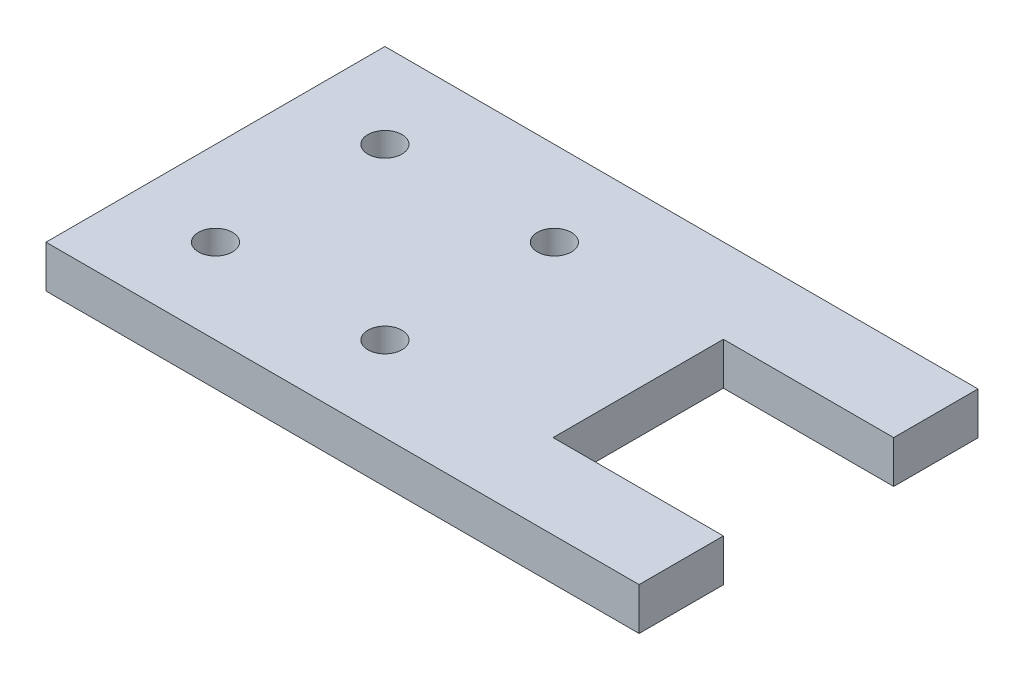
ISO-10303-21;
HEADER;
FILE_DESCRIPTION(('STEP AP214'),'2;1');
FILE_NAME('part.step','',(''),(''),'','','');
FILE_SCHEMA(('AUTOMOTIVE_DESIGN { 1 0 10303 214 1 1 1 1 }'));
ENDSEC;
DATA;
#1=APPLICATION_CONTEXT('core data for automotive mechanical design processes');
#2=APPLICATION_PROTOCOL_DEFINITION('international standard','automotive_design',2000,#1);
#3=PRODUCT_CONTEXT('',#1,'mechanical');
#4=PRODUCT('Part','Part','',(#3));
#5=PRODUCT_RELATED_PRODUCT_CATEGORY('part','',(#4));
#6=PRODUCT_DEFINITION_FORMATION('','',#4);
#7=PRODUCT_DEFINITION_CONTEXT('part definition',#1,'design');
#8=PRODUCT_DEFINITION('design','',#6,#7);
#9=PRODUCT_DEFINITION_SHAPE('','',#8);
#10=(LENGTH_UNIT() NAMED_UNIT(*) SI_UNIT(.MILLI.,.METRE.));
#11=(NAMED_UNIT(*) PLANE_ANGLE_UNIT() SI_UNIT($,.RADIAN.));
#12=(NAMED_UNIT(*) SI_UNIT($,.STERADIAN.) SOLID_ANGLE_UNIT());
#13=UNCERTAINTY_MEASURE_WITH_UNIT(LENGTH_MEASURE(1.E-05),#10,'distance_accuracy_value','');
#14=(GEOMETRIC_REPRESENTATION_CONTEXT(3) GLOBAL_UNCERTAINTY_ASSIGNED_CONTEXT((#13)) GLOBAL_UNIT_ASSIGNED_CONTEXT((#10,
#11,#12)) REPRESENTATION_CONTEXT('',''));
#15=CARTESIAN_POINT('',(0.,0.,0.));
#16=DIRECTION('',(0.,0.,1.));
#17=DIRECTION('',(1.,0.,0.));
#18=AXIS2_PLACEMENT_3D('',#15,#16,#17);
#19=CARTESIAN_POINT('',(57.15,6.35,-25.4));
#20=DIRECTION('',(-1.,0.,0.));
#21=DIRECTION('',(0.,0.,1.));
#22=AXIS2_PLACEMENT_3D('',#19,#20,#21);
#23=PLANE('',#22);
#24=DIRECTION('',(0.,0.,-1.));
#25=VECTOR('',#24,1.);
#26=CARTESIAN_POINT('',(57.15,0.,-25.4));
#27=LINE('',#26,#25);
#28=CARTESIAN_POINT('',(57.15,0.,25.4));
#29=VERTEX_POINT('',#28);
#30=CARTESIAN_POINT('',(57.15,0.,12.7635));
#31=VERTEX_POINT('',#30);
#32=EDGE_CURVE('E157',#29,#31,#27,.T.);
#33=ORIENTED_EDGE('',*,*,#32,.T.);
#34=DIRECTION('',(0.,1.,0.));
#35=VECTOR('',#34,1.);
#36=CARTESIAN_POINT('',(57.15,0.,12.7635));
#37=LINE('',#36,#35);
#38=CARTESIAN_POINT('',(57.15,6.35,12.7635));
#39=VERTEX_POINT('',#38);
#40=EDGE_CURVE('E228',#31,#39,#37,.T.);
#41=ORIENTED_EDGE('',*,*,#40,.T.);
#42=DIRECTION('',(0.,0.,-1.));
#43=VECTOR('',#42,1.);
#44=CARTESIAN_POINT('',(57.15,6.35,-25.4));
#45=LINE('',#44,#43);
#46=CARTESIAN_POINT('',(57.15,6.35,25.4));
#47=VERTEX_POINT('',#46);
#48=EDGE_CURVE('E174',#47,#39,#45,.T.);
#49=ORIENTED_EDGE('',*,*,#48,.F.);
#50=DIRECTION('',(0.,-1.,0.));
#51=VECTOR('',#50,1.);
#52=CARTESIAN_POINT('',(57.15,6.35,25.4));
#53=LINE('',#52,#51);
#54=EDGE_CURVE('E173',#47,#29,#53,.T.);
#55=ORIENTED_EDGE('',*,*,#54,.T.);
#56=EDGE_LOOP('',(#33,#41,#49,#55));
#57=FACE_BOUND('',#56,.T.);
#58=ADVANCED_FACE('F47',(#57),#23,.F.);
#59=CARTESIAN_POINT('',(-31.75,6.35,25.4));
#60=DIRECTION('',(1.,0.,0.));
#61=DIRECTION('',(0.,0.,-1.));
#62=AXIS2_PLACEMENT_3D('',#59,#60,#61);
#63=PLANE('',#62);
#64=DIRECTION('',(0.,0.,1.));
#65=VECTOR('',#64,1.);
#66=CARTESIAN_POINT('',(-31.75,0.,25.4));
#67=LINE('',#66,#65);
#68=CARTESIAN_POINT('',(-31.75,0.,-25.4));
#69=VERTEX_POINT('',#68);
#70=CARTESIAN_POINT('',(-31.75,0.,25.4));
#71=VERTEX_POINT('',#70);
#72=EDGE_CURVE('E164',#69,#71,#67,.T.);
#73=ORIENTED_EDGE('',*,*,#72,.T.);
#74=DIRECTION('',(0.,-1.,0.));
#75=VECTOR('',#74,1.);
#76=CARTESIAN_POINT('',(-31.75,6.35,25.4));
#77=LINE('',#76,#75);
#78=CARTESIAN_POINT('',(-31.75,6.35,25.4));
#79=VERTEX_POINT('',#78);
#80=EDGE_CURVE('E56',#79,#71,#77,.T.);
#81=ORIENTED_EDGE('',*,*,#80,.F.);
#82=DIRECTION('',(0.,0.,1.));
#83=VECTOR('',#82,1.);
#84=CARTESIAN_POINT('',(-31.75,6.35,25.4));
#85=LINE('',#84,#83);
#86=CARTESIAN_POINT('',(-31.75,6.35,-25.4));
#87=VERTEX_POINT('',#86);
#88=EDGE_CURVE('E112',#87,#79,#85,.T.);
#89=ORIENTED_EDGE('',*,*,#88,.F.);
#90=DIRECTION('',(0.,-1.,0.));
#91=VECTOR('',#90,1.);
#92=CARTESIAN_POINT('',(-31.75,6.35,-25.4));
#93=LINE('',#92,#91);
#94=EDGE_CURVE('E11',#87,#69,#93,.T.);
#95=ORIENTED_EDGE('',*,*,#94,.T.);
#96=EDGE_LOOP('',(#73,#81,#89,#95));
#97=FACE_BOUND('',#96,.T.);
#98=ADVANCED_FACE('F49',(#97),#63,.F.);
#99=CARTESIAN_POINT('',(57.15,6.35,25.4));
#100=DIRECTION('',(0.,0.,-1.));
#101=DIRECTION('',(-1.,0.,0.));
#102=AXIS2_PLACEMENT_3D('',#99,#100,#101);
#103=PLANE('',#102);
#104=DIRECTION('',(1.,0.,0.));
#105=VECTOR('',#104,1.);
#106=CARTESIAN_POINT('',(57.15,0.,25.4));
#107=LINE('',#106,#105);
#108=EDGE_CURVE('E158',#71,#29,#107,.T.);
#109=ORIENTED_EDGE('',*,*,#108,.T.);
#110=ORIENTED_EDGE('',*,*,#54,.F.);
#111=DIRECTION('',(1.,0.,0.));
#112=VECTOR('',#111,1.);
#113=CARTESIAN_POINT('',(-31.75,6.35,25.4));
#114=LINE('',#113,#112);
#115=EDGE_CURVE('E185',#79,#47,#114,.T.);
#116=ORIENTED_EDGE('',*,*,#115,.F.);
#117=ORIENTED_EDGE('',*,*,#80,.T.);
#118=EDGE_LOOP('',(#109,#110,#116,#117));
#119=FACE_BOUND('',#118,.T.);
#120=ADVANCED_FACE('F183',(#119),#103,.F.);
#121=CARTESIAN_POINT('',(57.15,6.35,-12.7635));
#122=VERTEX_POINT('',#121);
#123=CARTESIAN_POINT('',(57.15,6.35,-25.4));
#124=VERTEX_POINT('',#123);
#125=EDGE_CURVE('E75',#122,#124,#45,.T.);
#126=ORIENTED_EDGE('',*,*,#125,.F.);
#127=DIRECTION('',(0.,1.,0.));
#128=VECTOR('',#127,1.);
#129=CARTESIAN_POINT('',(57.15,0.,-12.7635));
#130=LINE('',#129,#128);
#131=CARTESIAN_POINT('',(57.15,0.,-12.7635));
#132=VERTEX_POINT('',#131);
#133=EDGE_CURVE('E140',#132,#122,#130,.T.);
#134=ORIENTED_EDGE('',*,*,#133,.F.);
#135=CARTESIAN_POINT('',(57.15,0.,-25.4));
#136=VERTEX_POINT('',#135);
#137=EDGE_CURVE('E103',#132,#136,#27,.T.);
#138=ORIENTED_EDGE('',*,*,#137,.T.);
#139=DIRECTION('',(0.,-1.,0.));
#140=VECTOR('',#139,1.);
#141=CARTESIAN_POINT('',(57.15,6.35,-25.4));
#142=LINE('',#141,#140);
#143=EDGE_CURVE('E171',#124,#136,#142,.T.);
#144=ORIENTED_EDGE('',*,*,#143,.F.);
#145=EDGE_LOOP('',(#126,#134,#138,#144));
#146=FACE_BOUND('',#145,.T.);
#147=ADVANCED_FACE('F146',(#146),#23,.F.);
#148=CARTESIAN_POINT('',(31.75,6.35,-25.4));
#149=DIRECTION('',(0.,0.,1.));
#150=DIRECTION('',(1.,0.,0.));
#151=AXIS2_PLACEMENT_3D('',#148,#149,#150);
#152=PLANE('',#151);
#153=DIRECTION('',(-1.,0.,0.));
#154=VECTOR('',#153,1.);
#155=CARTESIAN_POINT('',(31.75,0.,-25.4));
#156=LINE('',#155,#154);
#157=EDGE_CURVE('E155',#136,#69,#156,.T.);
#158=ORIENTED_EDGE('',*,*,#157,.T.);
#159=ORIENTED_EDGE('',*,*,#94,.F.);
#160=DIRECTION('',(-1.,0.,0.));
#161=VECTOR('',#160,1.);
#162=CARTESIAN_POINT('',(-31.75,6.35,-25.4));
#163=LINE('',#162,#161);
#164=EDGE_CURVE('E170',#124,#87,#163,.T.);
#165=ORIENTED_EDGE('',*,*,#164,.F.);
#166=ORIENTED_EDGE('',*,*,#143,.T.);
#167=EDGE_LOOP('',(#158,#159,#165,#166));
#168=FACE_BOUND('',#167,.T.);
#169=ADVANCED_FACE('F259',(#168),#152,.F.);
#170=CARTESIAN_POINT('',(0.,6.35,0.));
#171=DIRECTION('',(0.,-1.,0.));
#172=DIRECTION('',(0.,0.,-1.));
#173=AXIS2_PLACEMENT_3D('',#170,#171,#172);
#174=PLANE('',#173);
#175=CARTESIAN_POINT('',(-19.05,6.35,-12.7));
#176=DIRECTION('',(0.,1.,0.));
#177=DIRECTION('',(0.,0.,1.));
#178=AXIS2_PLACEMENT_3D('',#175,#176,#177);
#179=CIRCLE('',#178,2.55269999999999);
#180=CARTESIAN_POINT('',(-19.05,6.35,-10.1473));
#181=VERTEX_POINT('',#180);
#182=EDGE_CURVE('E225',#181,#181,#179,.T.);
#183=ORIENTED_EDGE('',*,*,#182,.F.);
#184=EDGE_LOOP('',(#183));
#185=FACE_BOUND('',#184,.T.);
#186=CARTESIAN_POINT('',(6.35000000000001,6.35,-12.7));
#187=DIRECTION('',(0.,1.,0.));
#188=DIRECTION('',(0.,0.,1.));
#189=AXIS2_PLACEMENT_3D('',#186,#187,#188);
#190=CIRCLE('',#189,2.55269999999999);
#191=CARTESIAN_POINT('',(6.35000000000001,6.35,-10.1473));
#192=VERTEX_POINT('',#191);
#193=EDGE_CURVE('E217',#192,#192,#190,.T.);
#194=ORIENTED_EDGE('',*,*,#193,.F.);
#195=EDGE_LOOP('',(#194));
#196=FACE_BOUND('',#195,.T.);
#197=CARTESIAN_POINT('',(6.35000000000001,6.35,12.7));
#198=DIRECTION('',(0.,1.,0.));
#199=DIRECTION('',(0.,0.,1.));
#200=AXIS2_PLACEMENT_3D('',#197,#198,#199);
#201=CIRCLE('',#200,2.55269999999999);
#202=CARTESIAN_POINT('',(6.35000000000001,6.35,15.2527));
#203=VERTEX_POINT('',#202);
#204=EDGE_CURVE('E209',#203,#203,#201,.T.);
#205=ORIENTED_EDGE('',*,*,#204,.F.);
#206=EDGE_LOOP('',(#205));
#207=FACE_BOUND('',#206,.T.);
#208=CARTESIAN_POINT('',(-19.05,6.35,12.7));
#209=DIRECTION('',(0.,1.,0.));
#210=DIRECTION('',(0.,0.,1.));
#211=AXIS2_PLACEMENT_3D('',#208,#209,#210);
#212=CIRCLE('',#211,2.55269999999999);
#213=CARTESIAN_POINT('',(-19.05,6.35,15.2527));
#214=VERTEX_POINT('',#213);
#215=EDGE_CURVE('E192',#214,#214,#212,.T.);
#216=ORIENTED_EDGE('',*,*,#215,.F.);
#217=EDGE_LOOP('',(#216));
#218=FACE_BOUND('',#217,.T.);
#219=ORIENTED_EDGE('',*,*,#48,.T.);
#220=DIRECTION('',(1.,0.,0.));
#221=VECTOR('',#220,1.);
#222=CARTESIAN_POINT('',(31.623,6.35,12.7635));
#223=LINE('',#222,#221);
#224=CARTESIAN_POINT('',(31.623,6.35,12.7635));
#225=VERTEX_POINT('',#224);
#226=EDGE_CURVE('E144',#225,#39,#223,.T.);
#227=ORIENTED_EDGE('',*,*,#226,.F.);
#228=DIRECTION('',(0.,0.,1.));
#229=VECTOR('',#228,1.);
#230=CARTESIAN_POINT('',(31.623,6.35,12.7635));
#231=LINE('',#230,#229);
#232=CARTESIAN_POINT('',(31.623,6.35,-12.7635));
#233=VERTEX_POINT('',#232);
#234=EDGE_CURVE('E240',#233,#225,#231,.T.);
#235=ORIENTED_EDGE('',*,*,#234,.F.);
#236=DIRECTION('',(-1.,0.,0.));
#237=VECTOR('',#236,1.);
#238=CARTESIAN_POINT('',(31.623,6.35,-12.7635));
#239=LINE('',#238,#237);
#240=EDGE_CURVE('E244',#122,#233,#239,.T.);
#241=ORIENTED_EDGE('',*,*,#240,.F.);
#242=ORIENTED_EDGE('',*,*,#125,.T.);
#243=ORIENTED_EDGE('',*,*,#164,.T.);
#244=ORIENTED_EDGE('',*,*,#88,.T.);
#245=ORIENTED_EDGE('',*,*,#115,.T.);
#246=EDGE_LOOP('',(#219,#227,#235,#241,#242,#243,#244,#245));
#247=FACE_BOUND('',#246,.T.);
#248=ADVANCED_FACE('F256',(#185,#196,#207,#218,#247),#174,.F.);
#249=CARTESIAN_POINT('',(0.,0.,0.));
#250=DIRECTION('',(0.,-1.,0.));
#251=DIRECTION('',(0.,0.,-1.));
#252=AXIS2_PLACEMENT_3D('',#249,#250,#251);
#253=PLANE('',#252);
#254=DIRECTION('',(1.,0.,0.));
#255=VECTOR('',#254,1.);
#256=CARTESIAN_POINT('',(31.623,0.,12.7635));
#257=LINE('',#256,#255);
#258=CARTESIAN_POINT('',(31.623,0.,12.7635));
#259=VERTEX_POINT('',#258);
#260=EDGE_CURVE('E148',#259,#31,#257,.T.);
#261=ORIENTED_EDGE('',*,*,#260,.T.);
#262=ORIENTED_EDGE('',*,*,#32,.F.);
#263=ORIENTED_EDGE('',*,*,#108,.F.);
#264=ORIENTED_EDGE('',*,*,#72,.F.);
#265=ORIENTED_EDGE('',*,*,#157,.F.);
#266=ORIENTED_EDGE('',*,*,#137,.F.);
#267=DIRECTION('',(-1.,0.,0.));
#268=VECTOR('',#267,1.);
#269=CARTESIAN_POINT('',(31.623,0.,-12.7635));
#270=LINE('',#269,#268);
#271=CARTESIAN_POINT('',(31.623,0.,-12.7635));
#272=VERTEX_POINT('',#271);
#273=EDGE_CURVE('E137',#132,#272,#270,.T.);
#274=ORIENTED_EDGE('',*,*,#273,.T.);
#275=DIRECTION('',(0.,0.,1.));
#276=VECTOR('',#275,1.);
#277=CARTESIAN_POINT('',(31.623,0.,12.7635));
#278=LINE('',#277,#276);
#279=EDGE_CURVE('E66',#272,#259,#278,.T.);
#280=ORIENTED_EDGE('',*,*,#279,.T.);
#281=EDGE_LOOP('',(#261,#262,#263,#264,#265,#266,#274,#280));
#282=FACE_BOUND('',#281,.T.);
#283=CARTESIAN_POINT('',(-19.05,0.,-12.7));
#284=DIRECTION('',(0.,1.,0.));
#285=DIRECTION('',(0.,0.,1.));
#286=AXIS2_PLACEMENT_3D('',#283,#284,#285);
#287=CIRCLE('',#286,2.5527);
#288=CARTESIAN_POINT('',(-19.05,0.,-10.1473));
#289=VERTEX_POINT('',#288);
#290=EDGE_CURVE('E221',#289,#289,#287,.T.);
#291=ORIENTED_EDGE('',*,*,#290,.T.);
#292=EDGE_LOOP('',(#291));
#293=FACE_BOUND('',#292,.T.);
#294=CARTESIAN_POINT('',(6.35000000000001,0.,-12.7));
#295=DIRECTION('',(0.,1.,0.));
#296=DIRECTION('',(0.,0.,1.));
#297=AXIS2_PLACEMENT_3D('',#294,#295,#296);
#298=CIRCLE('',#297,2.5527);
#299=CARTESIAN_POINT('',(6.35000000000001,0.,-10.1473));
#300=VERTEX_POINT('',#299);
#301=EDGE_CURVE('E213',#300,#300,#298,.T.);
#302=ORIENTED_EDGE('',*,*,#301,.T.);
#303=EDGE_LOOP('',(#302));
#304=FACE_BOUND('',#303,.T.);
#305=CARTESIAN_POINT('',(6.35000000000001,0.,12.7));
#306=DIRECTION('',(0.,1.,0.));
#307=DIRECTION('',(0.,0.,1.));
#308=AXIS2_PLACEMENT_3D('',#305,#306,#307);
#309=CIRCLE('',#308,2.5527);
#310=CARTESIAN_POINT('',(6.35000000000001,0.,15.2527));
#311=VERTEX_POINT('',#310);
#312=EDGE_CURVE('E205',#311,#311,#309,.T.);
#313=ORIENTED_EDGE('',*,*,#312,.T.);
#314=EDGE_LOOP('',(#313));
#315=FACE_BOUND('',#314,.T.);
#316=CARTESIAN_POINT('',(-19.05,0.,12.7));
#317=DIRECTION('',(0.,1.,0.));
#318=DIRECTION('',(0.,0.,1.));
#319=AXIS2_PLACEMENT_3D('',#316,#317,#318);
#320=CIRCLE('',#319,2.5527);
#321=CARTESIAN_POINT('',(-19.05,0.,15.2527));
#322=VERTEX_POINT('',#321);
#323=EDGE_CURVE('E188',#322,#322,#320,.T.);
#324=ORIENTED_EDGE('',*,*,#323,.T.);
#325=EDGE_LOOP('',(#324));
#326=FACE_BOUND('',#325,.T.);
#327=ADVANCED_FACE('F152',(#282,#293,#304,#315,#326),#253,.T.);
#328=CARTESIAN_POINT('',(-19.05,6.35,12.7));
#329=DIRECTION('',(0.,1.,0.));
#330=DIRECTION('',(0.,0.,1.));
#331=AXIS2_PLACEMENT_3D('',#328,#329,#330);
#332=CYLINDRICAL_SURFACE('',#331,2.55269999999999);
#333=ORIENTED_EDGE('',*,*,#323,.F.);
#334=EDGE_LOOP('',(#333));
#335=FACE_BOUND('',#334,.T.);
#336=ORIENTED_EDGE('',*,*,#215,.T.);
#337=EDGE_LOOP('',(#336));
#338=FACE_BOUND('',#337,.T.);
#339=ADVANCED_FACE('F288',(#335,#338),#332,.F.);
#340=CARTESIAN_POINT('',(6.35000000000001,6.35,12.7));
#341=DIRECTION('',(0.,1.,0.));
#342=DIRECTION('',(0.,0.,1.));
#343=AXIS2_PLACEMENT_3D('',#340,#341,#342);
#344=CYLINDRICAL_SURFACE('',#343,2.55269999999999);
#345=ORIENTED_EDGE('',*,*,#312,.F.);
#346=EDGE_LOOP('',(#345));
#347=FACE_BOUND('',#346,.T.);
#348=ORIENTED_EDGE('',*,*,#204,.T.);
#349=EDGE_LOOP('',(#348));
#350=FACE_BOUND('',#349,.T.);
#351=ADVANCED_FACE('F339',(#347,#350),#344,.F.);
#352=CARTESIAN_POINT('',(6.35000000000001,6.35,-12.7));
#353=DIRECTION('',(0.,1.,0.));
#354=DIRECTION('',(0.,0.,1.));
#355=AXIS2_PLACEMENT_3D('',#352,#353,#354);
#356=CYLINDRICAL_SURFACE('',#355,2.55269999999999);
#357=ORIENTED_EDGE('',*,*,#301,.F.);
#358=EDGE_LOOP('',(#357));
#359=FACE_BOUND('',#358,.T.);
#360=ORIENTED_EDGE('',*,*,#193,.T.);
#361=EDGE_LOOP('',(#360));
#362=FACE_BOUND('',#361,.T.);
#363=ADVANCED_FACE('F330',(#359,#362),#356,.F.);
#364=CARTESIAN_POINT('',(-19.05,6.35,-12.7));
#365=DIRECTION('',(0.,1.,0.));
#366=DIRECTION('',(0.,0.,1.));
#367=AXIS2_PLACEMENT_3D('',#364,#365,#366);
#368=CYLINDRICAL_SURFACE('',#367,2.55269999999999);
#369=ORIENTED_EDGE('',*,*,#290,.F.);
#370=EDGE_LOOP('',(#369));
#371=FACE_BOUND('',#370,.T.);
#372=ORIENTED_EDGE('',*,*,#182,.T.);
#373=EDGE_LOOP('',(#372));
#374=FACE_BOUND('',#373,.T.);
#375=ADVANCED_FACE('F301',(#371,#374),#368,.F.);
#376=CARTESIAN_POINT('',(31.623,0.,12.7635));
#377=DIRECTION('',(0.,0.,1.));
#378=DIRECTION('',(1.,0.,0.));
#379=AXIS2_PLACEMENT_3D('',#376,#377,#378);
#380=PLANE('',#379);
#381=ORIENTED_EDGE('',*,*,#226,.T.);
#382=ORIENTED_EDGE('',*,*,#40,.F.);
#383=ORIENTED_EDGE('',*,*,#260,.F.);
#384=DIRECTION('',(0.,1.,0.));
#385=VECTOR('',#384,1.);
#386=CARTESIAN_POINT('',(31.623,0.,12.7635));
#387=LINE('',#386,#385);
#388=EDGE_CURVE('E232',#259,#225,#387,.T.);
#389=ORIENTED_EDGE('',*,*,#388,.T.);
#390=EDGE_LOOP('',(#381,#382,#383,#389));
#391=FACE_BOUND('',#390,.T.);
#392=ADVANCED_FACE('F296',(#391),#380,.F.);
#393=CARTESIAN_POINT('',(31.623,0.,12.7635));
#394=DIRECTION('',(-1.,0.,0.));
#395=DIRECTION('',(0.,0.,1.));
#396=AXIS2_PLACEMENT_3D('',#393,#394,#395);
#397=PLANE('',#396);
#398=ORIENTED_EDGE('',*,*,#234,.T.);
#399=ORIENTED_EDGE('',*,*,#388,.F.);
#400=ORIENTED_EDGE('',*,*,#279,.F.);
#401=DIRECTION('',(0.,1.,0.));
#402=VECTOR('',#401,1.);
#403=CARTESIAN_POINT('',(31.623,0.,-12.7635));
#404=LINE('',#403,#402);
#405=EDGE_CURVE('E141',#272,#233,#404,.T.);
#406=ORIENTED_EDGE('',*,*,#405,.T.);
#407=EDGE_LOOP('',(#398,#399,#400,#406));
#408=FACE_BOUND('',#407,.T.);
#409=ADVANCED_FACE('F300',(#408),#397,.F.);
#410=CARTESIAN_POINT('',(31.623,0.,-12.7635));
#411=DIRECTION('',(0.,0.,-1.));
#412=DIRECTION('',(-1.,0.,0.));
#413=AXIS2_PLACEMENT_3D('',#410,#411,#412);
#414=PLANE('',#413);
#415=ORIENTED_EDGE('',*,*,#240,.T.);
#416=ORIENTED_EDGE('',*,*,#405,.F.);
#417=ORIENTED_EDGE('',*,*,#273,.F.);
#418=ORIENTED_EDGE('',*,*,#133,.T.);
#419=EDGE_LOOP('',(#415,#416,#417,#418));
#420=FACE_BOUND('',#419,.T.);
#421=ADVANCED_FACE('F139',(#420),#414,.F.);
#422=CLOSED_SHELL('',(#58,#98,#120,#147,#169,#248,#327,#339,#351,#363,#375,#392,#409,#421));
#423=MANIFOLD_SOLID_BREP('B2',#422);
#424=ADVANCED_BREP_SHAPE_REPRESENTATION('',(#18,#423),#14);
#425=SHAPE_DEFINITION_REPRESENTATION(#9,#424);
ENDSEC;
END-ISO-10303-21;
